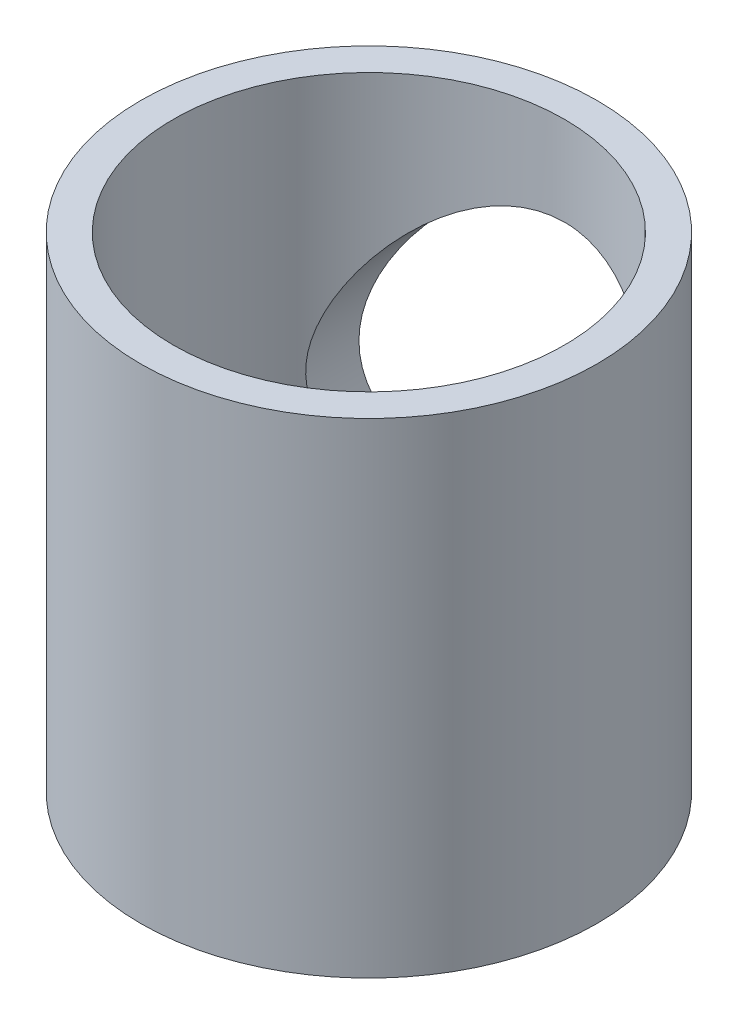
ISO-10303-21;
HEADER;
FILE_DESCRIPTION(('STEP AP214'),'2;1');
FILE_NAME('part.step','',(''),(''),'','','');
FILE_SCHEMA(('AUTOMOTIVE_DESIGN { 1 0 10303 214 1 1 1 1 }'));
ENDSEC;
DATA;
#1=APPLICATION_CONTEXT('core data for automotive mechanical design processes');
#2=APPLICATION_PROTOCOL_DEFINITION('international standard','automotive_design',2000,#1);
#3=PRODUCT_CONTEXT('',#1,'mechanical');
#4=PRODUCT('Part','Part','',(#3));
#5=PRODUCT_RELATED_PRODUCT_CATEGORY('part','',(#4));
#6=PRODUCT_DEFINITION_FORMATION('','',#4);
#7=PRODUCT_DEFINITION_CONTEXT('part definition',#1,'design');
#8=PRODUCT_DEFINITION('design','',#6,#7);
#9=PRODUCT_DEFINITION_SHAPE('','',#8);
#10=(LENGTH_UNIT() NAMED_UNIT(*) SI_UNIT(.MILLI.,.METRE.));
#11=(NAMED_UNIT(*) PLANE_ANGLE_UNIT() SI_UNIT($,.RADIAN.));
#12=(NAMED_UNIT(*) SI_UNIT($,.STERADIAN.) SOLID_ANGLE_UNIT());
#13=UNCERTAINTY_MEASURE_WITH_UNIT(LENGTH_MEASURE(1.E-05),#10,'distance_accuracy_value','');
#14=(GEOMETRIC_REPRESENTATION_CONTEXT(3) GLOBAL_UNCERTAINTY_ASSIGNED_CONTEXT((#13)) GLOBAL_UNIT_ASSIGNED_CONTEXT((#10,
#11,#12)) REPRESENTATION_CONTEXT('',''));
#15=CARTESIAN_POINT('',(0.,0.,0.));
#16=DIRECTION('',(0.,0.,1.));
#17=DIRECTION('',(1.,0.,0.));
#18=AXIS2_PLACEMENT_3D('',#15,#16,#17);
#19=CARTESIAN_POINT('',(0.,38.3,0.));
#20=DIRECTION('',(0.,-1.,0.));
#21=DIRECTION('',(0.,0.,-1.));
#22=AXIS2_PLACEMENT_3D('',#19,#20,#21);
#23=CYLINDRICAL_SURFACE('',#22,10.5);
#24=CARTESIAN_POINT('',(0.,0.,0.));
#25=DIRECTION('',(0.,1.,0.));
#26=DIRECTION('',(0.,0.,1.));
#27=AXIS2_PLACEMENT_3D('',#24,#25,#26);
#28=CIRCLE('',#27,10.5);
#29=CARTESIAN_POINT('',(0.,0.,10.5));
#30=VERTEX_POINT('',#29);
#31=EDGE_CURVE('E11',#30,#30,#28,.T.);
#32=ORIENTED_EDGE('',*,*,#31,.T.);
#33=EDGE_LOOP('',(#32));
#34=FACE_BOUND('',#33,.T.);
#35=CARTESIAN_POINT('',(0.,18.2,-10.5));
#36=CARTESIAN_POINT('',(-0.18813396926989,18.1999981399652,-10.4999982143638));
#37=CARTESIAN_POINT('',(-0.37632023168205,18.1930472478068,-10.494931071505));
#38=CARTESIAN_POINT('',(-0.751217544132532,18.1653490834224,-10.4747770476934));
#39=CARTESIAN_POINT('',(-0.93792761183307,18.1445932975088,-10.4596839836098));
#40=CARTESIAN_POINT('',(-1.30867183138487,18.0895664432479,-10.4197985544311));
#41=CARTESIAN_POINT('',(-1.49269999850735,18.0552688753554,-10.3949871725866));
#42=CARTESIAN_POINT('',(-1.85643183581326,17.9736733501462,-10.3362288065562));
#43=CARTESIAN_POINT('',(-2.03613354441446,17.9263696123128,-10.3022777604401));
#44=CARTESIAN_POINT('',(-2.38884760730317,17.8197747030476,-10.2262278665124));
#45=CARTESIAN_POINT('',(-2.56189565818614,17.7605628943339,-10.1841830361428));
#46=CARTESIAN_POINT('',(-2.90163513474682,17.6306872716277,-10.0926468767225));
#47=CARTESIAN_POINT('',(-3.06832402227701,17.5600189428385,-10.0431526125444));
#48=CARTESIAN_POINT('',(-3.55741728882151,17.3320677308045,-9.88493262830776));
#49=CARTESIAN_POINT('',(-3.86931659038185,17.1586945091357,-9.76636500186583));
#50=CARTESIAN_POINT('',(-4.48760223352023,16.7574278433571,-9.49922125826219));
#51=CARTESIAN_POINT('',(-4.79090179549309,16.5260079288354,-9.34889592100059));
#52=CARTESIAN_POINT('',(-5.35720552875823,16.0241413328602,-9.03631328380783));
#53=CARTESIAN_POINT('',(-5.62014479892603,15.7536331238741,-8.87403737413817));
#54=CARTESIAN_POINT('',(-6.00567504746141,15.2938981501326,-8.61464430894793));
#55=CARTESIAN_POINT('',(-6.14206918453724,15.1159500069083,-8.51767225553696));
#56=CARTESIAN_POINT('',(-6.39933226270985,14.7477963236592,-8.3261173931474));
#57=CARTESIAN_POINT('',(-6.52019677668207,14.5575873114575,-8.23153527162722));
#58=CARTESIAN_POINT('',(-6.74552753651135,14.1654408645094,-8.04791676019386));
#59=CARTESIAN_POINT('',(-6.8500124826915,13.963517170629,-7.95887411706089));
#60=CARTESIAN_POINT('',(-7.04170529057769,13.5482046926106,-7.78978224863079));
#61=CARTESIAN_POINT('',(-7.12892275827684,13.3348223674427,-7.70972803381294));
#62=CARTESIAN_POINT('',(-7.31125384149064,12.8225829701512,-7.53765367493881));
#63=CARTESIAN_POINT('',(-7.39905925729172,12.5192280829539,-7.45074551299657));
#64=CARTESIAN_POINT('',(-7.50265593878444,12.0526863884303,-7.34592068809347));
#65=CARTESIAN_POINT('',(-7.53249458883303,11.8953402474772,-7.31524477142138));
#66=CARTESIAN_POINT('',(-7.58237567206683,11.5775687348941,-7.26353079491979));
#67=CARTESIAN_POINT('',(-7.60242298245825,11.4171449377613,-7.24248793705429));
#68=CARTESIAN_POINT('',(-7.63244969817804,11.0930522322078,-7.21083882593878));
#69=CARTESIAN_POINT('',(-7.64234934859619,10.9293677717043,-7.20031526423087));
#70=CARTESIAN_POINT('',(-7.65158638369177,10.6013639511191,-7.19049881455281));
#71=CARTESIAN_POINT('',(-7.6509241611486,10.4370446148746,-7.19120550894715));
#72=CARTESIAN_POINT('',(-7.63904868963788,10.1091230680915,-7.20381898632499));
#73=CARTESIAN_POINT('',(-7.62782884953874,9.94552136968114,-7.21573276590194));
#74=CARTESIAN_POINT('',(-7.59507754339413,9.62049005326289,-7.25019689537212));
#75=CARTESIAN_POINT('',(-7.5735449244802,9.45906068017463,-7.27274843445925));
#76=CARTESIAN_POINT('',(-7.51758263391757,9.12137458051139,-7.33060348325488));
#77=CARTESIAN_POINT('',(-7.48196684382898,8.94551368291596,-7.36706353309181));
#78=CARTESIAN_POINT('',(-7.39916408141991,8.59893538583553,-7.4502217241013));
#79=CARTESIAN_POINT('',(-7.35196934932312,8.42822152220906,-7.49692672882889));
#80=CARTESIAN_POINT('',(-7.24665154923289,8.09244796092917,-7.5987768934508));
#81=CARTESIAN_POINT('',(-7.18850847844725,7.92739927671452,-7.65393746695728));
#82=CARTESIAN_POINT('',(-7.06202946602937,7.6037437227824,-7.77078840738445));
#83=CARTESIAN_POINT('',(-6.99369633380648,7.44513509282237,-7.8324769731747));
#84=CARTESIAN_POINT('',(-6.82249035233985,7.08170792325707,-7.98251801055776));
#85=CARTESIAN_POINT('',(-6.71576992241137,6.87949565056934,-8.07280935446103));
#86=CARTESIAN_POINT('',(-6.48592972635248,6.4871269243779,-8.25860596710564));
#87=CARTESIAN_POINT('',(-6.36280481560688,6.29697428062477,-8.35411286593137));
#88=CARTESIAN_POINT('',(-6.10070585253969,5.92885523117093,-8.54739303889987));
#89=CARTESIAN_POINT('',(-5.96171750591403,5.75090005119443,-8.64516829281177));
#90=CARTESIAN_POINT('',(-5.66845389629616,5.40781667363975,-8.84022884761121));
#91=CARTESIAN_POINT('',(-5.51418033227573,5.24268705411552,-8.93751420169143));
#92=CARTESIAN_POINT('',(-5.18859094840874,4.92384618568326,-9.13043235853823));
#93=CARTESIAN_POINT('',(-5.0170798850278,4.77031100100795,-9.2260273118198));
#94=CARTESIAN_POINT('',(-4.65911124736444,4.47805091948602,-9.41187292319723));
#95=CARTESIAN_POINT('',(-4.47265210490244,4.33932758009607,-9.50212301884105));
#96=CARTESIAN_POINT('',(-4.08576113617971,4.07826085762536,-9.67477879002408));
#97=CARTESIAN_POINT('',(-3.88535720165399,3.95588613010096,-9.75719938637782));
#98=CARTESIAN_POINT('',(-3.47117976005621,3.72877324928194,-9.91210065116896));
#99=CARTESIAN_POINT('',(-3.25741132385175,3.6240284617246,-9.98458505674654));
#100=CARTESIAN_POINT('',(-2.87421920951223,3.45823772722763,-10.1003981364266));
#101=CARTESIAN_POINT('',(-2.70746998481837,3.39287205748762,-10.1464382366331));
#102=CARTESIAN_POINT('',(-2.36809683891222,3.2735344389724,-10.2309664417583));
#103=CARTESIAN_POINT('',(-2.195474217944,3.21955998723873,-10.2694562055586));
#104=CARTESIAN_POINT('',(-1.84537583092436,3.12369474490672,-10.3381038369576));
#105=CARTESIAN_POINT('',(-1.66790265051404,3.0817976487702,-10.368266051987));
#106=CARTESIAN_POINT('',(-1.30915092884654,3.01063252845523,-10.4196427409978));
#107=CARTESIAN_POINT('',(-1.12787228769624,2.98136483623367,-10.4408569797862));
#108=CARTESIAN_POINT('',(-0.762139828546284,2.93582071263672,-10.4739190087213));
#109=CARTESIAN_POINT('',(-0.577676647248945,2.91959345093864,-10.4857313468897));
#110=CARTESIAN_POINT('',(-0.20769002934746,2.90057673380158,-10.4995777807668));
#111=CARTESIAN_POINT('',(-0.0221665945380221,2.89778725562299,-10.5016118930223));
#112=CARTESIAN_POINT('',(0.34844469032207,2.90569213984369,-10.495853254121));
#113=CARTESIAN_POINT('',(0.533532523611192,2.91638701287618,-10.4880601308207));
#114=CARTESIAN_POINT('',(0.90178425556191,2.95108641588602,-10.4628316340537));
#115=CARTESIAN_POINT('',(1.08494820583934,2.97509058785421,-10.4453965199487));
#116=CARTESIAN_POINT('',(1.43751983367347,3.03427436266542,-10.4025593627168));
#117=CARTESIAN_POINT('',(1.60711271069616,3.06873163250217,-10.3776733361537));
#118=CARTESIAN_POINT('',(1.94239027010075,3.14869370464981,-10.3201774845422));
#119=CARTESIAN_POINT('',(2.10807360229379,3.19420226406406,-10.2875650328358));
#120=CARTESIAN_POINT('',(2.43454851069882,3.29571271407372,-10.2152295168319));
#121=CARTESIAN_POINT('',(2.59534131406075,3.35171194663522,-10.1755082538158));
#122=CARTESIAN_POINT('',(2.91137940452989,3.47362424114776,-10.0896348979107));
#123=CARTESIAN_POINT('',(3.06662262763971,3.53954094508717,-10.0434804430236));
#124=CARTESIAN_POINT('',(3.54811490253685,3.7628790819522,-9.88839395063588));
#125=CARTESIAN_POINT('',(3.86317682427225,3.93753443806534,-9.76889971587814));
#126=CARTESIAN_POINT('',(4.46047109300588,4.32475214635417,-9.51106101196677));
#127=CARTESIAN_POINT('',(4.74268166454582,4.53733940785956,-9.37270417018564));
#128=CARTESIAN_POINT('',(5.16405169859677,4.90216854548694,-9.14409026903782));
#129=CARTESIAN_POINT('',(5.31459213708507,5.04363546391864,-9.05724437054079));
#130=CARTESIAN_POINT('',(5.60320787180947,5.33761260460758,-8.88158622053186));
#131=CARTESIAN_POINT('',(5.74128537018437,5.49012086729886,-8.79277431986969));
#132=CARTESIAN_POINT('',(6.00482319432873,5.80585273287608,-8.61495194250752));
#133=CARTESIAN_POINT('',(6.1302709688214,5.96908673383582,-8.52594135639713));
#134=CARTESIAN_POINT('',(6.36803803533501,6.30581995002009,-8.34984816714546));
#135=CARTESIAN_POINT('',(6.4803590747341,6.47931779432131,-8.26276530864667));
#136=CARTESIAN_POINT('',(6.67909525227569,6.81559764520371,-8.10271692362111));
#137=CARTESIAN_POINT('',(6.76700400749004,6.97727668322203,-8.02928793402629));
#138=CARTESIAN_POINT('',(6.93171296775669,7.30838892284332,-7.88753188767274));
#139=CARTESIAN_POINT('',(7.00851282920288,7.47782236408228,-7.81920498875695));
#140=CARTESIAN_POINT('',(7.15024086349212,7.82392842023445,-7.68981477016785));
#141=CARTESIAN_POINT('',(7.21518835191363,8.00058867192449,-7.62873969014919));
#142=CARTESIAN_POINT('',(7.33255075894619,8.36092140119284,-7.51600483589084));
#143=CARTESIAN_POINT('',(7.38497074585457,8.5445910079741,-7.46434125602393));
#144=CARTESIAN_POINT('',(7.46641039960603,8.87733397419177,-7.38276878590249));
#145=CARTESIAN_POINT('',(7.49804025313637,9.02520997740366,-7.3505728159243));
#146=CARTESIAN_POINT('',(7.5526516557548,9.32403138486712,-7.29444930999026));
#147=CARTESIAN_POINT('',(7.57563822637968,9.47497495303812,-7.270516973727));
#148=CARTESIAN_POINT('',(7.61258488663328,9.77898097910474,-7.23182348085043));
#149=CARTESIAN_POINT('',(7.62655420353553,9.93204110674783,-7.21705294965257));
#150=CARTESIAN_POINT('',(7.64524035544194,10.2393626686147,-7.19725559998933));
#151=CARTESIAN_POINT('',(7.64995714149531,10.3936241091898,-7.19222883307363));
#152=CARTESIAN_POINT('',(7.65004234576412,10.7024067940209,-7.19213822600669));
#153=CARTESIAN_POINT('',(7.64539536106002,10.8569280478987,-7.19709080135808));
#154=CARTESIAN_POINT('',(7.62681683942761,11.1647739122332,-7.21677524907196));
#155=CARTESIAN_POINT('',(7.61288533795025,11.3180985272569,-7.23150708409445));
#156=CARTESIAN_POINT('',(7.57598067539312,11.6226484041966,-7.27016003451669));
#157=CARTESIAN_POINT('',(7.55299728952589,11.7738710911397,-7.29409154090612));
#158=CARTESIAN_POINT('',(7.49836015789735,12.0732435788829,-7.35024657983814));
#159=CARTESIAN_POINT('',(7.46670129928126,12.2213915120295,-7.382475001454));
#160=CARTESIAN_POINT('',(7.38439181441591,12.5578854783813,-7.46492424622157));
#161=CARTESIAN_POINT('',(7.33089297054969,12.7449262282992,-7.51764135310293));
#162=CARTESIAN_POINT('',(7.2109171544905,13.1117278810864,-7.63279620767396));
#163=CARTESIAN_POINT('',(7.14443460102987,13.291485612959,-7.69523813339567));
#164=CARTESIAN_POINT('',(6.99925073657402,13.643423566118,-7.82752467088559));
#165=CARTESIAN_POINT('',(6.92053451255461,13.8155942053993,-7.89737828418907));
#166=CARTESIAN_POINT('',(6.7516174692877,14.1518842391017,-8.04226600894416));
#167=CARTESIAN_POINT('',(6.66141742016052,14.3160041723923,-8.1172997728538));
#168=CARTESIAN_POINT('',(6.46721945702913,14.6407714800592,-8.27290787282129));
#169=CARTESIAN_POINT('',(6.36289454352744,14.8011759702198,-8.35358015309865));
#170=CARTESIAN_POINT('',(6.14295713915771,15.1132255236852,-8.51662060736358));
#171=CARTESIAN_POINT('',(6.02734075522712,15.2648675369857,-8.59898935847995));
#172=CARTESIAN_POINT('',(5.78510479632348,15.5591301024567,-8.76379066353136));
#173=CARTESIAN_POINT('',(5.65848267323413,15.7017485521587,-8.84622322783898));
#174=CARTESIAN_POINT('',(5.39449123452464,15.9775599221635,-9.00963765298163));
#175=CARTESIAN_POINT('',(5.25712166806297,16.1107526223346,-9.09061947990271));
#176=CARTESIAN_POINT('',(4.94009495028054,16.3957627202032,-9.26743291044601));
#177=CARTESIAN_POINT('',(4.75782813067895,16.5451331178375,-9.36256098182103));
#178=CARTESIAN_POINT('',(4.37800632983063,16.8278668702608,-9.5460753707552));
#179=CARTESIAN_POINT('',(4.18044788415649,16.9612265801526,-9.63446015151423));
#180=CARTESIAN_POINT('',(3.77103624037095,17.2102653118354,-9.80194641625185));
#181=CARTESIAN_POINT('',(3.5591973582059,17.3259616718322,-9.88105698578036));
#182=CARTESIAN_POINT('',(3.12229577014148,17.5380366441425,-10.0276760137063));
#183=CARTESIAN_POINT('',(2.89724001201679,17.6344252905413,-10.0951904958959));
#184=CARTESIAN_POINT('',(2.50138016160148,17.7816422103477,-10.1991308760185));
#185=CARTESIAN_POINT('',(2.33336145014622,17.8376301966056,-10.2389364487615));
#186=CARTESIAN_POINT('',(1.9923137214248,17.9381503386983,-10.3107237509196));
#187=CARTESIAN_POINT('',(1.81928590192728,17.9826852084157,-10.3427073337126));
#188=CARTESIAN_POINT('',(1.46968094882015,18.0596271035141,-10.3981387729157));
#189=CARTESIAN_POINT('',(1.29311390274476,18.0920645279123,-10.421608020436));
#190=CARTESIAN_POINT('',(0.937255956587137,18.1444955277512,-10.4596144131665));
#191=CARTESIAN_POINT('',(0.757966556661614,18.1644957187998,-10.4741563069583));
#192=CARTESIAN_POINT('',(0.481932166002982,18.1854130032884,-10.4893760839373));
#193=CARTESIAN_POINT('',(0.385684076397071,18.1908798073014,-10.4933568408316));
#194=CARTESIAN_POINT('',(0.192961932438432,18.1981740809221,-10.4986694738695));
#195=CARTESIAN_POINT('',(0.0964878436385955,18.2000009539518,-10.5000009157952));
#196=CARTESIAN_POINT('',(0.,18.2,-10.5));
#197=B_SPLINE_CURVE_WITH_KNOTS('',3,(#35,#36,#37,#38,#39,#40,#41,#42,#43,#44,#45,#46,#47,#48,
#49,#50,#51,#52,#53,#54,#55,#56,#57,#58,#59,#60,#61,#62,#63,#64,#65,#66,#67,#68,#69,#70,#71,#72,
#73,#74,#75,#76,#77,#78,#79,#80,#81,#82,#83,#84,#85,#86,#87,#88,#89,#90,#91,#92,#93,#94,#95,#96,
#97,#98,#99,#100,#101,#102,#103,#104,#105,#106,#107,#108,#109,#110,#111,#112,#113,#114,#115,
#116,#117,#118,#119,#120,#121,#122,#123,#124,#125,#126,#127,#128,#129,#130,#131,#132,#133,#134,
#135,#136,#137,#138,#139,#140,#141,#142,#143,#144,#145,#146,#147,#148,#149,#150,#151,#152,#153,
#154,#155,#156,#157,#158,#159,#160,#161,#162,#163,#164,#165,#166,#167,#168,#169,#170,#171,#172,
#173,#174,#175,#176,#177,#178,#179,#180,#181,#182,#183,#184,#185,#186,#187,#188,#189,#190,#191,
#192,#193,#194,#195,#196),.UNSPECIFIED.,.T.,.F.,(4,2,2,2,2,2,2,2,2,2,2,2,2,2,2,2,2,2,2,2,2,2,2,
2,2,2,2,2,2,2,2,2,2,2,2,2,2,2,2,2,2,2,2,2,2,2,2,2,2,2,2,2,2,2,2,2,2,2,2,2,2,2,2,2,2,2,2,2,2,2,2,
2,2,2,2,2,2,2,2,2,4),(0.,0.56429778731997,1.12894390874426,1.69470049114161,2.26070892835776,
2.82306320477424,3.38563963544401,4.50930585685701,5.73526651163271,6.96317836572284,
7.69532651571444,8.42768292274419,9.15919702186227,9.89030302508527,10.8687092693252,
11.357397364889,11.845841789039,12.3380963418961,12.8303325886255,13.3228763429815,
13.8154751718003,14.3639649976298,14.9128234098296,15.4626944997145,16.0124142689562,
16.748882395205,17.4855820315411,18.2229508172451,18.9602377352009,19.7070961713952,
20.4540330621293,21.199516678576,21.944719134364,22.4989532481268,23.0530654545949,
23.6068878351783,24.16072477179,24.7166403103938,25.2725549082688,25.8284905584707,
26.3844112551872,26.9083512766069,27.4324696717313,27.956455449543,28.4806341222044,
29.6146799504435,30.7494732493912,31.4211931599454,32.0927941476677,32.7650561098037,
33.4372284809557,34.0311695768296,34.6251290398033,35.2181117219941,35.8108540913208,
36.27424030601,36.7373568871008,37.1999988107914,37.6626431820969,38.1260492007624,
38.5894534500212,39.0533826576475,39.5175858702926,40.1213488140611,40.7253718691193,
41.3301370976147,41.9348617911047,42.5573161377156,43.1799858563128,43.802800125211,
44.4256289347129,45.1869930767998,45.9485302191295,46.7093149687023,47.4697033120303,
48.0137208902745,48.5576094413662,49.1001219254471,49.6423455891204,49.931708297885,
50.2211184287605),.UNSPECIFIED.);
#198=CARTESIAN_POINT('',(0.,18.2,-10.5));
#199=VERTEX_POINT('',#198);
#200=EDGE_CURVE('E129',#199,#199,#197,.T.);
#201=ORIENTED_EDGE('',*,*,#200,.T.);
#202=EDGE_LOOP('',(#201));
#203=FACE_BOUND('',#202,.T.);
#204=CARTESIAN_POINT('',(0.,22.3,0.));
#205=DIRECTION('',(0.,1.,0.));
#206=DIRECTION('',(0.,0.,1.));
#207=AXIS2_PLACEMENT_3D('',#204,#205,#206);
#208=CIRCLE('',#207,10.5);
#209=CARTESIAN_POINT('',(0.,22.3,10.5));
#210=VERTEX_POINT('',#209);
#211=EDGE_CURVE('E140',#210,#210,#208,.T.);
#212=ORIENTED_EDGE('',*,*,#211,.F.);
#213=EDGE_LOOP('',(#212));
#214=FACE_BOUND('',#213,.T.);
#215=ADVANCED_FACE('F114',(#34,#203,#214),#23,.T.);
#216=CARTESIAN_POINT('',(0.,38.3,0.));
#217=DIRECTION('',(0.,-1.,0.));
#218=DIRECTION('',(0.,0.,-1.));
#219=AXIS2_PLACEMENT_3D('',#216,#217,#218);
#220=CYLINDRICAL_SURFACE('',#219,9.);
#221=CARTESIAN_POINT('',(0.,0.,0.));
#222=DIRECTION('',(0.,1.,0.));
#223=DIRECTION('',(0.,0.,1.));
#224=AXIS2_PLACEMENT_3D('',#221,#222,#223);
#225=CIRCLE('',#224,9.);
#226=CARTESIAN_POINT('',(0.,0.,9.));
#227=VERTEX_POINT('',#226);
#228=EDGE_CURVE('E123',#227,#227,#225,.T.);
#229=ORIENTED_EDGE('',*,*,#228,.F.);
#230=EDGE_LOOP('',(#229));
#231=FACE_BOUND('',#230,.T.);
#232=CARTESIAN_POINT('',(0.,18.2,-9.));
#233=CARTESIAN_POINT('',(-0.180599816712313,18.2000036611238,-9.00000360299185));
#234=CARTESIAN_POINT('',(-0.361163723686839,18.1935966080455,-8.99455535515891));
#235=CARTESIAN_POINT('',(-0.720805739657176,18.1680986474798,-8.97289694257527));
#236=CARTESIAN_POINT('',(-0.899883433285622,18.1490043074997,-8.95668386544575));
#237=CARTESIAN_POINT('',(-1.25515725428233,18.0984641170708,-8.91384493688113));
#238=CARTESIAN_POINT('',(-1.43135093803302,18.0670083052897,-8.88721068775473));
#239=CARTESIAN_POINT('',(-1.77948556892554,17.9922874312635,-8.82410007497103));
#240=CARTESIAN_POINT('',(-1.95142463714356,17.9490172495976,-8.78761944474358));
#241=CARTESIAN_POINT('',(-2.28871950441446,17.8517031074448,-8.70584159011783));
#242=CARTESIAN_POINT('',(-2.45411215398031,17.7977345025027,-8.66060608167815));
#243=CARTESIAN_POINT('',(-2.77876111637483,17.679575306584,-8.56196740042664));
#244=CARTESIAN_POINT('',(-2.93801470974371,17.6153802487074,-8.50856065883696));
#245=CARTESIAN_POINT('',(-3.24963848684958,17.4775804072476,-8.39448486343957));
#246=CARTESIAN_POINT('',(-3.402010163543,17.4039776779545,-8.33381739529149));
#247=CARTESIAN_POINT('',(-3.69948187286627,17.2481000543184,-8.20609828956513));
#248=CARTESIAN_POINT('',(-3.84458032673155,17.1658232890673,-8.13904527498723));
#249=CARTESIAN_POINT('',(-4.18034643938942,16.9608579005236,-7.97318774358538));
#250=CARTESIAN_POINT('',(-4.3676365263026,16.8346057551434,-7.87192380646368));
#251=CARTESIAN_POINT('',(-4.72747652955682,16.5686018967244,-7.66123165277427));
#252=CARTESIAN_POINT('',(-4.90002127700561,16.4288454861263,-7.55180059824888));
#253=CARTESIAN_POINT('',(-5.23062353783406,16.1367568066028,-7.32670859582809));
#254=CARTESIAN_POINT('',(-5.38864459855897,15.9843946252559,-7.21103307006561));
#255=CARTESIAN_POINT('',(-5.6897290134981,15.6683129946004,-6.97592002478588));
#256=CARTESIAN_POINT('',(-5.83279431275382,15.5045950267644,-6.85648299709884));
#257=CARTESIAN_POINT('',(-6.10672713420529,15.1629462564598,-6.61377460576016));
#258=CARTESIAN_POINT('',(-6.2372984879539,14.9847988461956,-6.49047407515343));
#259=CARTESIAN_POINT('',(-6.482977939577,14.6172343004138,-6.24508903042606));
#260=CARTESIAN_POINT('',(-6.59808089209403,14.4278134450171,-6.12300493337691));
#261=CARTESIAN_POINT('',(-6.81227379659363,14.0378085504978,-5.88375930007182));
#262=CARTESIAN_POINT('',(-6.91139838263264,13.8372499582075,-5.76658753565988));
#263=CARTESIAN_POINT('',(-7.09317960620709,13.4240644564738,-5.5414536468287));
#264=CARTESIAN_POINT('',(-7.17584982323132,13.2114476862131,-5.43348397053089));
#265=CARTESIAN_POINT('',(-7.32851620558681,12.7582129233783,-5.22594525967913));
#266=CARTESIAN_POINT('',(-7.39729031766375,12.5166733235668,-5.12742546295841));
#267=CARTESIAN_POINT('',(-7.48326187458956,12.1435956477424,-5.00034405280151));
#268=CARTESIAN_POINT('',(-7.50904434518002,12.0175164213465,-4.96144953428405));
#269=CARTESIAN_POINT('',(-7.55448787090564,11.7620352555881,-4.89197612325607));
#270=CARTESIAN_POINT('',(-7.57415219538839,11.6326351309683,-4.8613927906151));
#271=CARTESIAN_POINT('',(-7.60719367206635,11.3691380489698,-4.80952951076495));
#272=CARTESIAN_POINT('',(-7.62047328092826,11.2349998989127,-4.78839422892247));
#273=CARTESIAN_POINT('',(-7.63993902562466,10.9649165686709,-4.75727579819358));
#274=CARTESIAN_POINT('',(-7.64612589228482,10.828971576121,-4.74729150032898));
#275=CARTESIAN_POINT('',(-7.65120778007609,10.5566549875266,-4.73909782914274));
#276=CARTESIAN_POINT('',(-7.65010687238061,10.4202836721927,-4.74088188165906));
#277=CARTESIAN_POINT('',(-7.64066762456329,10.1484769431941,-4.7560763341783));
#278=CARTESIAN_POINT('',(-7.63232929060261,10.0130415287329,-4.76948672428381));
#279=CARTESIAN_POINT('',(-7.60028196566713,9.64942073642459,-4.82050077090965));
#280=CARTESIAN_POINT('',(-7.56987844927957,9.42323152739679,-4.86849914279792));
#281=CARTESIAN_POINT('',(-7.49075248395732,8.98095751581095,-4.98936043622822));
#282=CARTESIAN_POINT('',(-7.44200115844835,8.76488924795622,-5.06226253554444));
#283=CARTESIAN_POINT('',(-7.33297222406577,8.36138670254785,-5.21879901344488));
#284=CARTESIAN_POINT('',(-7.27396913962325,8.17305782743959,-5.30106133211077));
#285=CARTESIAN_POINT('',(-7.14343162825316,7.8055600197452,-5.47569862410736));
#286=CARTESIAN_POINT('',(-7.07188752848383,7.62639829656272,-5.56808138251929));
#287=CARTESIAN_POINT('',(-6.91686361466089,7.27643770227781,-5.759532735188));
#288=CARTESIAN_POINT('',(-6.83335487155996,7.10566048812345,-5.85861721761623));
#289=CARTESIAN_POINT('',(-6.65498480105072,6.77251890453674,-6.06047221439951));
#290=CARTESIAN_POINT('',(-6.56012625202836,6.61015249006398,-6.16324182235462));
#291=CARTESIAN_POINT('',(-6.3517346895948,6.28167820828871,-6.378048522995));
#292=CARTESIAN_POINT('',(-6.23733594883805,6.11619716584202,-6.49020434643994));
#293=CARTESIAN_POINT('',(-5.99570244009948,5.79452801100948,-6.71406662101314));
#294=CARTESIAN_POINT('',(-5.86846624921597,5.63834093182249,-6.82577302089727));
#295=CARTESIAN_POINT('',(-5.60132699730449,5.33575945513435,-7.04663999656296));
#296=CARTESIAN_POINT('',(-5.46144179020651,5.18935174674998,-7.15580389540907));
#297=CARTESIAN_POINT('',(-5.168763788678,4.90661584006878,-7.36999141346288));
#298=CARTESIAN_POINT('',(-5.01596748601321,4.77029040034261,-7.47501389591145));
#299=CARTESIAN_POINT('',(-4.71103458697867,4.51972496309908,-7.67047016300387));
#300=CARTESIAN_POINT('',(-4.55994134380825,4.40459246363914,-7.76138578041883));
#301=CARTESIAN_POINT('',(-4.24712732175004,4.18439073019375,-7.93687977738459));
#302=CARTESIAN_POINT('',(-4.08540848746372,4.07931966345587,-8.02145931047912));
#303=CARTESIAN_POINT('',(-3.75170514935602,3.88029792669619,-8.18285029738847));
#304=CARTESIAN_POINT('',(-3.57972673773554,3.7863407541311,-8.25966628964525));
#305=CARTESIAN_POINT('',(-3.22595659941241,3.6106422670314,-8.40414702910606));
#306=CARTESIAN_POINT('',(-3.04416670497776,3.5288986823132,-8.4718134767462));
#307=CARTESIAN_POINT('',(-2.7027014054321,3.39137544110981,-8.58616344031408));
#308=CARTESIAN_POINT('',(-2.54439383745816,3.33353924813563,-8.6344643293896));
#309=CARTESIAN_POINT('',(-2.222257213273,3.22792445121562,-8.72292711534354));
#310=CARTESIAN_POINT('',(-2.05842923583336,3.18014389531777,-8.7630905917609));
#311=CARTESIAN_POINT('',(-1.72619351385821,3.09532809665001,-8.8345408017867));
#312=CARTESIAN_POINT('',(-1.55778796736882,3.05828779296803,-8.86583171607918));
#313=CARTESIAN_POINT('',(-1.2174000709161,2.9955056634497,-8.91894636384492));
#314=CARTESIAN_POINT('',(-1.04541768331284,2.96976395657416,-8.94076999763895));
#315=CARTESIAN_POINT('',(-0.698432239942122,2.92994039120734,-8.97455829716669));
#316=CARTESIAN_POINT('',(-0.523419811832908,2.91590588335415,-8.98648292470033));
#317=CARTESIAN_POINT('',(-0.172443115815647,2.89992666186027,-9.00006134555704));
#318=CARTESIAN_POINT('',(0.00352115331245654,2.8979819637198,-9.00171512571195));
#319=CARTESIAN_POINT('',(0.354959404086938,2.90621823074758,-8.99471484501872));
#320=CARTESIAN_POINT('',(0.530433380384725,2.91639932768215,-8.98606067215805));
#321=CARTESIAN_POINT('',(0.879472759681113,2.94870110992323,-8.95863672501922));
#322=CARTESIAN_POINT('',(1.05303820874143,2.97082150643024,-8.93986719542125));
#323=CARTESIAN_POINT('',(1.38616361599847,3.02486081587621,-8.89410071688913));
#324=CARTESIAN_POINT('',(1.54591967021725,3.05607886689838,-8.86769302278233));
#325=CARTESIAN_POINT('',(1.86171371242474,3.12822353847765,-8.80680936722267));
#326=CARTESIAN_POINT('',(2.01775027031171,3.16915382907088,-8.77233035586764));
#327=CARTESIAN_POINT('',(2.32521938534658,3.26017425130109,-8.69588691350605));
#328=CARTESIAN_POINT('',(2.47665243479147,3.31026339944695,-8.65392328622004));
#329=CARTESIAN_POINT('',(2.77430435248879,3.41902148883053,-8.56314536157));
#330=CARTESIAN_POINT('',(2.92052222306265,3.47769206088482,-8.51432976212625));
#331=CARTESIAN_POINT('',(3.25519123864129,3.62397609933643,-8.39315833173497));
#332=CARTESIAN_POINT('',(3.44141493107024,3.71470738729827,-8.31838932024314));
#333=CARTESIAN_POINT('',(3.80285398500914,3.90899609296338,-8.15949185081781));
#334=CARTESIAN_POINT('',(3.97806628203297,4.01255705756583,-8.0753608053085));
#335=CARTESIAN_POINT('',(4.31729694513159,4.23143465579033,-7.89921114632948));
#336=CARTESIAN_POINT('',(4.48129437375064,4.34677232643003,-7.80717846633221));
#337=CARTESIAN_POINT('',(4.79754628541746,4.58798554577968,-7.61692980701432));
#338=CARTESIAN_POINT('',(4.94979815558324,4.71386342631997,-7.51871246064656));
#339=CARTESIAN_POINT('',(5.27897284724892,5.00788351386106,-7.29257364218721));
#340=CARTESIAN_POINT('',(5.45258408574692,5.17873903636836,-7.16335100834447));
#341=CARTESIAN_POINT('',(5.78143585698064,5.534404078531,-6.90067387553667));
#342=CARTESIAN_POINT('',(5.93666903815216,5.71921913416174,-6.76721770996518));
#343=CARTESIAN_POINT('',(6.22874758935057,6.10216899350467,-6.49938088505661));
#344=CARTESIAN_POINT('',(6.36559470667993,6.30030252881877,-6.36500031484718));
#345=CARTESIAN_POINT('',(6.62075049967444,6.70989906998693,-6.0991417837548));
#346=CARTESIAN_POINT('',(6.73906879514866,6.92135507856282,-5.96766234732502));
#347=CARTESIAN_POINT('',(6.91414503495399,7.27293112659535,-5.7623842145206));
#348=CARTESIAN_POINT('',(6.97689595495407,7.40865085667984,-5.68611629095383));
#349=CARTESIAN_POINT('',(7.09507046712222,7.68553853912022,-5.53795431784834));
#350=CARTESIAN_POINT('',(7.15049593825486,7.82670508232947,-5.46605914926975));
#351=CARTESIAN_POINT('',(7.25357252870508,8.11453423959525,-5.32851409881753));
#352=CARTESIAN_POINT('',(7.30123649842355,8.26118726436334,-5.26285397056653));
#353=CARTESIAN_POINT('',(7.38834433358377,8.56023645885712,-5.13984832210278));
#354=CARTESIAN_POINT('',(7.42779074742656,8.71263083073163,-5.08250022587394));
#355=CARTESIAN_POINT('',(7.51485870729068,9.09903952431883,-4.95334529071284));
#356=CARTESIAN_POINT('',(7.55710527678835,9.33665777497977,-4.8880993288462));
#357=CARTESIAN_POINT('',(7.60360446577451,9.69991973386466,-4.81518581055608));
#358=CARTESIAN_POINT('',(7.61629003986731,9.82207620436392,-4.79504482612611));
#359=CARTESIAN_POINT('',(7.63579412135983,10.0679945548722,-4.763926288278));
#360=CARTESIAN_POINT('',(7.64261545901561,10.1917556311407,-4.75294431452369));
#361=CARTESIAN_POINT('',(7.65023891553312,10.4406915024373,-4.7406643299908));
#362=CARTESIAN_POINT('',(7.65100462866877,10.5658703238477,-4.7394248904905));
#363=CARTESIAN_POINT('',(7.64640210102135,10.8158162865171,-4.74684663094413));
#364=CARTESIAN_POINT('',(7.64103387528994,10.9405834287856,-4.75550778660361));
#365=CARTESIAN_POINT('',(7.62429623745144,11.1888322218631,-4.78229576242353));
#366=CARTESIAN_POINT('',(7.61291939566343,11.3123120877625,-4.80043430111349));
#367=CARTESIAN_POINT('',(7.58442590178306,11.5570651828786,-4.84532621457056));
#368=CARTESIAN_POINT('',(7.56730599594275,11.678337120033,-4.87208447251993));
#369=CARTESIAN_POINT('',(7.52113364809629,11.9575228408573,-4.94316543416573));
#370=CARTESIAN_POINT('',(7.490008394655,12.1143598275144,-4.99037049421648));
#371=CARTESIAN_POINT('',(7.41899707731149,12.4224345914265,-5.09533998284398));
#372=CARTESIAN_POINT('',(7.37910556127903,12.5736688153646,-5.15311097908114));
#373=CARTESIAN_POINT('',(7.29111872382239,12.8708127023086,-5.27687077784935));
#374=CARTESIAN_POINT('',(7.24299871951544,13.0167046931436,-5.34288413925521));
#375=CARTESIAN_POINT('',(7.13917312426291,13.3027907863114,-5.48084595088265));
#376=CARTESIAN_POINT('',(7.08346877779643,13.4429858185413,-5.5527934266413));
#377=CARTESIAN_POINT('',(6.92876654223955,13.8015713407277,-5.74590278163212));
#378=CARTESIAN_POINT('',(6.82403109140339,14.0157059681446,-5.87040155630666));
#379=CARTESIAN_POINT('',(6.59670316709471,14.430986618492,-6.12475963660223));
#380=CARTESIAN_POINT('',(6.47410051903202,14.6321251458776,-6.25462196613636));
#381=CARTESIAN_POINT('',(6.21138270623976,15.0217345293344,-6.51559789650995));
#382=CARTESIAN_POINT('',(6.07126846394726,15.2102060518467,-6.64671143110543));
#383=CARTESIAN_POINT('',(5.77359679508388,15.5742746782857,-6.90685514743795));
#384=CARTESIAN_POINT('',(5.61604542970237,15.7498762207909,-7.03588603534946));
#385=CARTESIAN_POINT('',(5.30724114807371,16.0633384115831,-7.27085021156942));
#386=CARTESIAN_POINT('',(5.15831924684661,16.2030019276521,-7.37744436419342));
#387=CARTESIAN_POINT('',(4.8475685475131,16.4716345438018,-7.58524955925996));
#388=CARTESIAN_POINT('',(4.68573937593608,16.6006033342113,-7.68646044579688));
#389=CARTESIAN_POINT('',(4.34953077174167,16.8466187603914,-7.88158032451708));
#390=CARTESIAN_POINT('',(4.17516958101332,16.9636821492323,-7.9754995320914));
#391=CARTESIAN_POINT('',(3.81403375463079,17.1847901780655,-8.15436810763525));
#392=CARTESIAN_POINT('',(3.62726240496932,17.2888382434202,-8.23931983473629));
#393=CARTESIAN_POINT('',(3.28179872272346,17.4624202153165,-8.38195342665508));
#394=CARTESIAN_POINT('',(3.12528161570297,17.5346428647857,-8.44164251896536));
#395=CARTESIAN_POINT('',(2.80538194871703,17.6691590939177,-8.55327524166938));
#396=CARTESIAN_POINT('',(2.64200084217707,17.7314547623236,-8.60522050129974));
#397=CARTESIAN_POINT('',(2.30929833785606,17.8452381097676,-8.70040391714047));
#398=CARTESIAN_POINT('',(2.13998533562576,17.8967403967164,-8.74365383847276));
#399=CARTESIAN_POINT('',(1.79623228932581,17.9882584468726,-8.82069046480542));
#400=CARTESIAN_POINT('',(1.62179364932245,18.0282773239833,-8.85447973514665));
#401=CARTESIAN_POINT('',(1.20937472254581,18.1076170338971,-8.9215737211155));
#402=CARTESIAN_POINT('',(0.969789000468794,18.1421591162038,-8.9508789001242));
#403=CARTESIAN_POINT('',(0.486780838013472,18.1883498805772,-8.99009109318037));
#404=CARTESIAN_POINT('',(0.243357817458025,18.1999950666445,-8.99999514497717));
#405=CARTESIAN_POINT('',(0.,18.2,-9.));
#406=B_SPLINE_CURVE_WITH_KNOTS('',3,(#232,#233,#234,#235,#236,#237,#238,#239,#240,#241,#242,
#243,#244,#245,#246,#247,#248,#249,#250,#251,#252,#253,#254,#255,#256,#257,#258,#259,#260,#261,
#262,#263,#264,#265,#266,#267,#268,#269,#270,#271,#272,#273,#274,#275,#276,#277,#278,#279,#280,
#281,#282,#283,#284,#285,#286,#287,#288,#289,#290,#291,#292,#293,#294,#295,#296,#297,#298,#299,
#300,#301,#302,#303,#304,#305,#306,#307,#308,#309,#310,#311,#312,#313,#314,#315,#316,#317,#318,
#319,#320,#321,#322,#323,#324,#325,#326,#327,#328,#329,#330,#331,#332,#333,#334,#335,#336,#337,
#338,#339,#340,#341,#342,#343,#344,#345,#346,#347,#348,#349,#350,#351,#352,#353,#354,#355,#356,
#357,#358,#359,#360,#361,#362,#363,#364,#365,#366,#367,#368,#369,#370,#371,#372,#373,#374,#375,
#376,#377,#378,#379,#380,#381,#382,#383,#384,#385,#386,#387,#388,#389,#390,#391,#392,#393,#394,
#395,#396,#397,#398,#399,#400,#401,#402,#403,#404,#405),.UNSPECIFIED.,.T.,.F.,(4,2,2,2,2,2,2,2,
2,2,2,2,2,2,2,2,2,2,2,2,2,2,2,2,2,2,2,2,2,2,2,2,2,2,2,2,2,2,2,2,2,2,2,2,2,2,2,2,2,2,2,2,2,2,2,2,
2,2,2,2,2,2,2,2,2,2,2,2,2,2,2,2,2,2,2,2,2,2,2,2,2,2,2,2,2,2,4),(0.,0.541543804646441,
1.08323418139929,1.6253619704128,2.16772504891383,2.70639561768003,3.245302125416,
3.78409115615854,4.32299663732149,5.06451492227493,5.8062920848994,6.5498828873944,
7.29337686305677,8.05153225981426,8.80993922591136,9.56667952811198,10.3227926930252,
11.1296222544926,11.532579245659,11.9353205378,12.3440333000575,12.7527039453692,
13.1611463140458,13.5695883350195,14.2662732444392,14.9640592432841,15.6045708512065,
16.2455786749039,16.8881633859516,17.5305911154949,18.2210173444313,18.9115201843882,
19.601063164547,20.2907941152462,20.9220213544916,21.5531333921751,22.1838743315197,
22.8144978865335,23.3399541908207,23.8653084017795,24.390414656891,24.9155264406147,
25.4427519194763,25.9699780742883,26.4972099583147,27.0244290897104,27.5186111561166,
28.0129802609915,28.5072963109528,29.0017064232463,29.6614444824246,30.3213653418709,
30.9824863720031,31.6437540515805,32.4698696057714,33.2963145128756,34.1226808239182,
34.9486166687801,35.4519187196679,35.9550914228977,36.4574223816967,36.9595973266253,
37.7063447413746,38.0793031686987,38.4520814939064,38.8270992291014,39.2021160440666,
39.5775976584245,39.9532923631601,40.4526373482331,40.9522937816732,41.4534761988724,
41.9545764782863,42.7602025517242,43.5662891998695,44.3723334046449,45.1780983011524,
45.8684327040252,46.5587870889076,47.2481561720686,47.9373434442034,48.4840845023186,
49.0307103679246,49.576591575444,50.1223246186808,50.8519421967856,51.5816711674778),.UNSPECIFIED.);
#407=CARTESIAN_POINT('',(0.,18.2,-9.));
#408=VERTEX_POINT('',#407);
#409=EDGE_CURVE('E132',#408,#408,#406,.T.);
#410=ORIENTED_EDGE('',*,*,#409,.F.);
#411=EDGE_LOOP('',(#410));
#412=FACE_BOUND('',#411,.T.);
#413=CARTESIAN_POINT('',(0.,22.3,0.));
#414=DIRECTION('',(0.,1.,0.));
#415=DIRECTION('',(0.,0.,1.));
#416=AXIS2_PLACEMENT_3D('',#413,#414,#415);
#417=CIRCLE('',#416,9.);
#418=CARTESIAN_POINT('',(0.,22.3,9.));
#419=VERTEX_POINT('',#418);
#420=EDGE_CURVE('E118',#419,#419,#417,.T.);
#421=ORIENTED_EDGE('',*,*,#420,.T.);
#422=EDGE_LOOP('',(#421));
#423=FACE_BOUND('',#422,.T.);
#424=ADVANCED_FACE('F141',(#231,#412,#423),#220,.F.);
#425=CARTESIAN_POINT('',(0.,0.,0.));
#426=DIRECTION('',(0.,1.,0.));
#427=DIRECTION('',(0.,0.,1.));
#428=AXIS2_PLACEMENT_3D('',#425,#426,#427);
#429=PLANE('',#428);
#430=ORIENTED_EDGE('',*,*,#31,.F.);
#431=EDGE_LOOP('',(#430));
#432=FACE_BOUND('',#431,.T.);
#433=ORIENTED_EDGE('',*,*,#228,.T.);
#434=EDGE_LOOP('',(#433));
#435=FACE_BOUND('',#434,.T.);
#436=ADVANCED_FACE('F148',(#432,#435),#429,.F.);
#437=CARTESIAN_POINT('',(0.,10.55,-15.5));
#438=DIRECTION('',(0.,0.,1.));
#439=DIRECTION('',(1.,0.,0.));
#440=AXIS2_PLACEMENT_3D('',#437,#438,#439);
#441=CYLINDRICAL_SURFACE('',#440,7.65);
#442=ORIENTED_EDGE('',*,*,#409,.T.);
#443=EDGE_LOOP('',(#442));
#444=FACE_BOUND('',#443,.T.);
#445=ORIENTED_EDGE('',*,*,#200,.F.);
#446=EDGE_LOOP('',(#445));
#447=FACE_BOUND('',#446,.T.);
#448=ADVANCED_FACE('F143',(#444,#447),#441,.F.);
#449=CARTESIAN_POINT('',(0.,22.3,0.));
#450=DIRECTION('',(0.,1.,0.));
#451=DIRECTION('',(0.,0.,1.));
#452=AXIS2_PLACEMENT_3D('',#449,#450,#451);
#453=PLANE('',#452);
#454=ORIENTED_EDGE('',*,*,#420,.F.);
#455=EDGE_LOOP('',(#454));
#456=FACE_BOUND('',#455,.T.);
#457=ORIENTED_EDGE('',*,*,#211,.T.);
#458=EDGE_LOOP('',(#457));
#459=FACE_BOUND('',#458,.T.);
#460=ADVANCED_FACE('F147',(#456,#459),#453,.T.);
#461=CLOSED_SHELL('',(#215,#424,#436,#448,#460));
#462=MANIFOLD_SOLID_BREP('B2',#461);
#463=ADVANCED_BREP_SHAPE_REPRESENTATION('',(#18,#462),#14);
#464=SHAPE_DEFINITION_REPRESENTATION(#9,#463);
ENDSEC;
END-ISO-10303-21;
